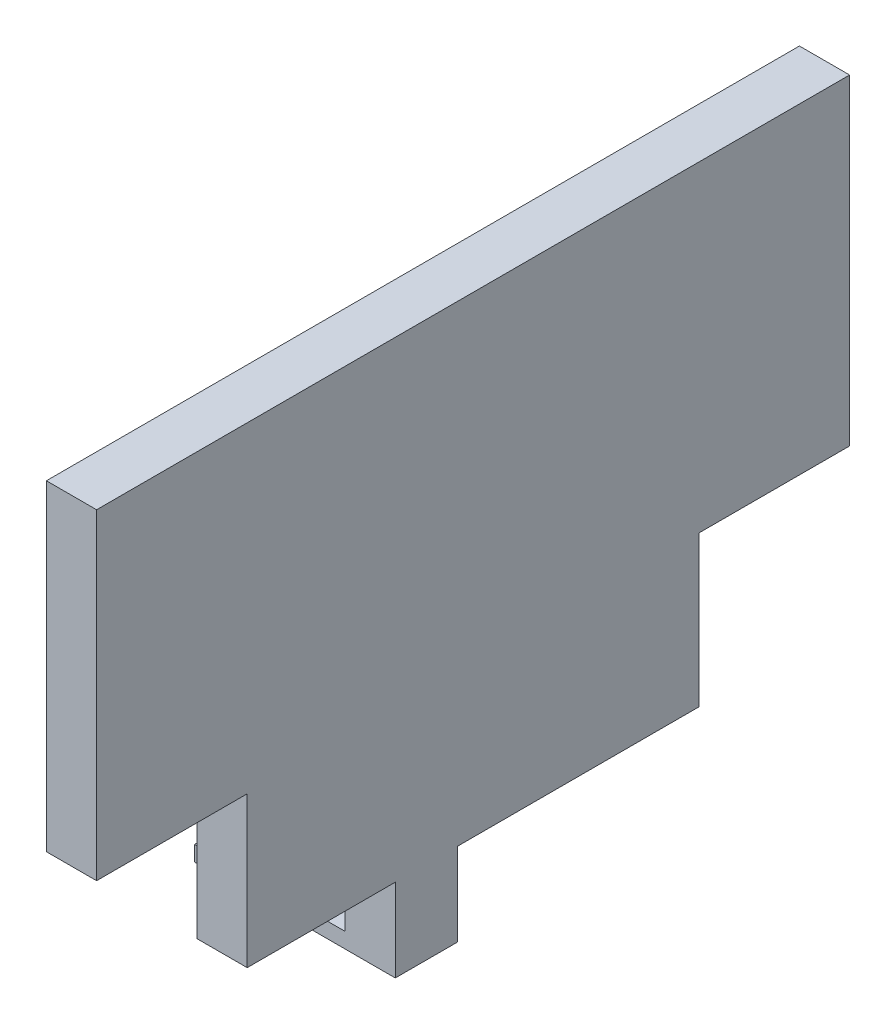
ISO-10303-21;
HEADER;
FILE_DESCRIPTION(('STEP AP214'),'2;1');
FILE_NAME('part.step','',(''),(''),'','','');
FILE_SCHEMA(('AUTOMOTIVE_DESIGN { 1 0 10303 214 1 1 1 1 }'));
ENDSEC;
DATA;
#1=APPLICATION_CONTEXT('core data for automotive mechanical design processes');
#2=APPLICATION_PROTOCOL_DEFINITION('international standard','automotive_design',2000,#1);
#3=PRODUCT_CONTEXT('',#1,'mechanical');
#4=PRODUCT('Part','Part','',(#3));
#5=PRODUCT_RELATED_PRODUCT_CATEGORY('part','',(#4));
#6=PRODUCT_DEFINITION_FORMATION('','',#4);
#7=PRODUCT_DEFINITION_CONTEXT('part definition',#1,'design');
#8=PRODUCT_DEFINITION('design','',#6,#7);
#9=PRODUCT_DEFINITION_SHAPE('','',#8);
#10=(LENGTH_UNIT() NAMED_UNIT(*) SI_UNIT(.MILLI.,.METRE.));
#11=(NAMED_UNIT(*) PLANE_ANGLE_UNIT() SI_UNIT($,.RADIAN.));
#12=(NAMED_UNIT(*) SI_UNIT($,.STERADIAN.) SOLID_ANGLE_UNIT());
#13=UNCERTAINTY_MEASURE_WITH_UNIT(LENGTH_MEASURE(1.E-05),#10,'distance_accuracy_value','');
#14=(GEOMETRIC_REPRESENTATION_CONTEXT(3) GLOBAL_UNCERTAINTY_ASSIGNED_CONTEXT((#13)) GLOBAL_UNIT_ASSIGNED_CONTEXT((#10,
#11,#12)) REPRESENTATION_CONTEXT('',''));
#15=CARTESIAN_POINT('',(0.,0.,0.));
#16=DIRECTION('',(0.,0.,1.));
#17=DIRECTION('',(1.,0.,0.));
#18=AXIS2_PLACEMENT_3D('',#15,#16,#17);
#19=CARTESIAN_POINT('',(-17.5633114324604,119.38,190.5));
#20=DIRECTION('',(1.,0.,0.));
#21=DIRECTION('',(0.,1.,0.));
#22=AXIS2_PLACEMENT_3D('',#19,#20,#21);
#23=PLANE('',#22);
#24=DIRECTION('',(0.,0.,-1.));
#25=VECTOR('',#24,1.);
#26=CARTESIAN_POINT('',(-17.5633114324604,-17.1281883855556,99.2583190448215));
#27=LINE('',#26,#25);
#28=CARTESIAN_POINT('',(-17.5633114324604,-17.1281883855556,114.935884156992));
#29=VERTEX_POINT('',#28);
#30=CARTESIAN_POINT('',(-17.5633114324604,-17.1281883855556,99.2583190448215));
#31=VERTEX_POINT('',#30);
#32=EDGE_CURVE('E51',#29,#31,#27,.T.);
#33=ORIENTED_EDGE('',*,*,#32,.F.);
#34=DIRECTION('',(0.,1.,0.));
#35=VECTOR('',#34,1.);
#36=CARTESIAN_POINT('',(-17.5633114324604,-41.1687256896944,114.935884156992));
#37=LINE('',#36,#35);
#38=CARTESIAN_POINT('',(-17.5633114324604,0.,114.935884156992));
#39=VERTEX_POINT('',#38);
#40=EDGE_CURVE('E177',#29,#39,#37,.T.);
#41=ORIENTED_EDGE('',*,*,#40,.T.);
#42=DIRECTION('',(0.,0.,-1.));
#43=VECTOR('',#42,1.);
#44=CARTESIAN_POINT('',(-17.5633114324604,0.,190.5));
#45=LINE('',#44,#43);
#46=CARTESIAN_POINT('',(-17.5633114324604,0.,152.4));
#47=VERTEX_POINT('',#46);
#48=EDGE_CURVE('E11',#47,#39,#45,.T.);
#49=ORIENTED_EDGE('',*,*,#48,.F.);
#50=DIRECTION('',(0.,-1.,0.));
#51=VECTOR('',#50,1.);
#52=CARTESIAN_POINT('',(-17.5633114324604,38.1,152.4));
#53=LINE('',#52,#51);
#54=CARTESIAN_POINT('',(-17.5633114324604,38.1,152.4));
#55=VERTEX_POINT('',#54);
#56=EDGE_CURVE('E237',#55,#47,#53,.T.);
#57=ORIENTED_EDGE('',*,*,#56,.F.);
#58=DIRECTION('',(0.,0.,-1.));
#59=VECTOR('',#58,1.);
#60=CARTESIAN_POINT('',(-17.5633114324604,38.1,190.5));
#61=LINE('',#60,#59);
#62=CARTESIAN_POINT('',(-17.5633114324604,38.1,190.5));
#63=VERTEX_POINT('',#62);
#64=EDGE_CURVE('E240',#63,#55,#61,.T.);
#65=ORIENTED_EDGE('',*,*,#64,.F.);
#66=DIRECTION('',(0.,-1.,0.));
#67=VECTOR('',#66,1.);
#68=CARTESIAN_POINT('',(-17.5633114324604,119.38,190.5));
#69=LINE('',#68,#67);
#70=CARTESIAN_POINT('',(-17.5633114324604,119.38,190.5));
#71=VERTEX_POINT('',#70);
#72=EDGE_CURVE('E252',#71,#63,#69,.T.);
#73=ORIENTED_EDGE('',*,*,#72,.F.);
#74=DIRECTION('',(0.,0.,-1.));
#75=VECTOR('',#74,1.);
#76=CARTESIAN_POINT('',(-17.5633114324604,119.38,190.5));
#77=LINE('',#76,#75);
#78=CARTESIAN_POINT('',(-17.5633114324604,119.38,0.));
#79=VERTEX_POINT('',#78);
#80=EDGE_CURVE('E259',#71,#79,#77,.T.);
#81=ORIENTED_EDGE('',*,*,#80,.T.);
#82=DIRECTION('',(0.,-1.,0.));
#83=VECTOR('',#82,1.);
#84=CARTESIAN_POINT('',(-17.5633114324604,119.38,0.));
#85=LINE('',#84,#83);
#86=CARTESIAN_POINT('',(-17.5633114324604,38.1,0.));
#87=VERTEX_POINT('',#86);
#88=EDGE_CURVE('E232',#79,#87,#85,.T.);
#89=ORIENTED_EDGE('',*,*,#88,.T.);
#90=DIRECTION('',(0.,0.,-1.));
#91=VECTOR('',#90,1.);
#92=CARTESIAN_POINT('',(-17.5633114324604,38.1,38.1));
#93=LINE('',#92,#91);
#94=CARTESIAN_POINT('',(-17.5633114324604,38.1,38.1));
#95=VERTEX_POINT('',#94);
#96=EDGE_CURVE('E281',#95,#87,#93,.T.);
#97=ORIENTED_EDGE('',*,*,#96,.F.);
#98=DIRECTION('',(0.,1.,0.));
#99=VECTOR('',#98,1.);
#100=CARTESIAN_POINT('',(-17.5633114324604,38.1,38.1));
#101=LINE('',#100,#99);
#102=CARTESIAN_POINT('',(-17.5633114324604,0.,38.1));
#103=VERTEX_POINT('',#102);
#104=EDGE_CURVE('E283',#103,#95,#101,.T.);
#105=ORIENTED_EDGE('',*,*,#104,.F.);
#106=CARTESIAN_POINT('',(-17.5633114324604,0.,99.2583190448215));
#107=VERTEX_POINT('',#106);
#108=EDGE_CURVE('E43',#107,#103,#45,.T.);
#109=ORIENTED_EDGE('',*,*,#108,.F.);
#110=DIRECTION('',(0.,1.,0.));
#111=VECTOR('',#110,1.);
#112=CARTESIAN_POINT('',(-17.5633114324604,-41.1687256896944,99.2583190448215));
#113=LINE('',#112,#111);
#114=EDGE_CURVE('E186',#31,#107,#113,.T.);
#115=ORIENTED_EDGE('',*,*,#114,.F.);
#116=EDGE_LOOP('',(#33,#41,#49,#57,#65,#73,#81,#89,#97,#105,#109,#115));
#117=FACE_BOUND('',#116,.T.);
#118=ADVANCED_FACE('F35',(#117),#23,.F.);
#119=CARTESIAN_POINT('',(-17.5633114324604,0.,190.5));
#120=DIRECTION('',(0.,1.,0.));
#121=DIRECTION('',(0.,0.,1.));
#122=AXIS2_PLACEMENT_3D('',#119,#120,#121);
#123=PLANE('',#122);
#124=DIRECTION('',(-1.,0.,0.));
#125=VECTOR('',#124,1.);
#126=CARTESIAN_POINT('',(-17.5633114324604,0.,114.935884156992));
#127=LINE('',#126,#125);
#128=CARTESIAN_POINT('',(-4.86331143246037,0.,114.935884156992));
#129=VERTEX_POINT('',#128);
#130=EDGE_CURVE('E58',#129,#39,#127,.T.);
#131=ORIENTED_EDGE('',*,*,#130,.F.);
#132=DIRECTION('',(0.,0.,-1.));
#133=VECTOR('',#132,1.);
#134=CARTESIAN_POINT('',(-4.86331143246037,0.,190.5));
#135=LINE('',#134,#133);
#136=CARTESIAN_POINT('',(-4.86331143246037,0.,152.4));
#137=VERTEX_POINT('',#136);
#138=EDGE_CURVE('E209',#137,#129,#135,.T.);
#139=ORIENTED_EDGE('',*,*,#138,.F.);
#140=DIRECTION('',(-1.,0.,0.));
#141=VECTOR('',#140,1.);
#142=CARTESIAN_POINT('',(-4.86331143246037,0.,152.4));
#143=LINE('',#142,#141);
#144=EDGE_CURVE('E230',#137,#47,#143,.T.);
#145=ORIENTED_EDGE('',*,*,#144,.T.);
#146=ORIENTED_EDGE('',*,*,#48,.T.);
#147=EDGE_LOOP('',(#131,#139,#145,#146));
#148=FACE_BOUND('',#147,.T.);
#149=ADVANCED_FACE('F229',(#148),#123,.F.);
#150=DIRECTION('',(1.,0.,0.));
#151=VECTOR('',#150,1.);
#152=CARTESIAN_POINT('',(-17.5633114324604,0.,99.2583190448215));
#153=LINE('',#152,#151);
#154=CARTESIAN_POINT('',(-4.86331143246037,0.,99.2583190448215));
#155=VERTEX_POINT('',#154);
#156=EDGE_CURVE('E188',#107,#155,#153,.T.);
#157=ORIENTED_EDGE('',*,*,#156,.F.);
#158=ORIENTED_EDGE('',*,*,#108,.T.);
#159=DIRECTION('',(-1.,0.,0.));
#160=VECTOR('',#159,1.);
#161=CARTESIAN_POINT('',(-4.86331143246037,0.,38.1));
#162=LINE('',#161,#160);
#163=CARTESIAN_POINT('',(-4.86331143246037,0.,38.1));
#164=VERTEX_POINT('',#163);
#165=EDGE_CURVE('E245',#164,#103,#162,.T.);
#166=ORIENTED_EDGE('',*,*,#165,.F.);
#167=EDGE_CURVE('E205',#155,#164,#135,.T.);
#168=ORIENTED_EDGE('',*,*,#167,.F.);
#169=EDGE_LOOP('',(#157,#158,#166,#168));
#170=FACE_BOUND('',#169,.T.);
#171=ADVANCED_FACE('F323',(#170),#123,.F.);
#172=CARTESIAN_POINT('',(-4.86331143246038,119.38,190.5));
#173=DIRECTION('',(-1.,0.,0.));
#174=DIRECTION('',(0.,-1.,0.));
#175=AXIS2_PLACEMENT_3D('',#172,#173,#174);
#176=PLANE('',#175);
#177=ORIENTED_EDGE('',*,*,#138,.T.);
#178=DIRECTION('',(0.,1.,0.));
#179=VECTOR('',#178,1.);
#180=CARTESIAN_POINT('',(-4.86331143246037,-41.1687256896944,114.935884156992));
#181=LINE('',#180,#179);
#182=CARTESIAN_POINT('',(-4.86331143246037,-20.9926,114.935884156992));
#183=VERTEX_POINT('',#182);
#184=EDGE_CURVE('E199',#183,#129,#181,.T.);
#185=ORIENTED_EDGE('',*,*,#184,.F.);
#186=DIRECTION('',(0.,0.,1.));
#187=VECTOR('',#186,1.);
#188=CARTESIAN_POINT('',(-4.86331143246037,-20.9926,114.935884156992));
#189=LINE('',#188,#187);
#190=CARTESIAN_POINT('',(-4.86331143246037,-20.9926,99.2583190448215));
#191=VERTEX_POINT('',#190);
#192=EDGE_CURVE('E150',#191,#183,#189,.T.);
#193=ORIENTED_EDGE('',*,*,#192,.F.);
#194=DIRECTION('',(0.,1.,0.));
#195=VECTOR('',#194,1.);
#196=CARTESIAN_POINT('',(-4.86331143246037,-41.1687256896944,99.2583190448215));
#197=LINE('',#196,#195);
#198=EDGE_CURVE('E147',#191,#155,#197,.T.);
#199=ORIENTED_EDGE('',*,*,#198,.T.);
#200=ORIENTED_EDGE('',*,*,#167,.T.);
#201=DIRECTION('',(0.,1.,0.));
#202=VECTOR('',#201,1.);
#203=CARTESIAN_POINT('',(-4.86331143246037,38.1,38.1));
#204=LINE('',#203,#202);
#205=CARTESIAN_POINT('',(-4.86331143246037,38.1,38.1));
#206=VERTEX_POINT('',#205);
#207=EDGE_CURVE('E285',#164,#206,#204,.T.);
#208=ORIENTED_EDGE('',*,*,#207,.T.);
#209=DIRECTION('',(0.,0.,-1.));
#210=VECTOR('',#209,1.);
#211=CARTESIAN_POINT('',(-4.86331143246037,38.1,38.1));
#212=LINE('',#211,#210);
#213=CARTESIAN_POINT('',(-4.86331143246037,38.1,0.));
#214=VERTEX_POINT('',#213);
#215=EDGE_CURVE('E288',#206,#214,#212,.T.);
#216=ORIENTED_EDGE('',*,*,#215,.T.);
#217=DIRECTION('',(0.,1.,0.));
#218=VECTOR('',#217,1.);
#219=CARTESIAN_POINT('',(-4.86331143246038,119.38,0.));
#220=LINE('',#219,#218);
#221=CARTESIAN_POINT('',(-4.86331143246038,119.38,0.));
#222=VERTEX_POINT('',#221);
#223=EDGE_CURVE('E262',#214,#222,#220,.T.);
#224=ORIENTED_EDGE('',*,*,#223,.T.);
#225=DIRECTION('',(0.,0.,-1.));
#226=VECTOR('',#225,1.);
#227=CARTESIAN_POINT('',(-4.86331143246038,119.38,190.5));
#228=LINE('',#227,#226);
#229=CARTESIAN_POINT('',(-4.86331143246038,119.38,190.5));
#230=VERTEX_POINT('',#229);
#231=EDGE_CURVE('E210',#230,#222,#228,.T.);
#232=ORIENTED_EDGE('',*,*,#231,.F.);
#233=DIRECTION('',(0.,1.,0.));
#234=VECTOR('',#233,1.);
#235=CARTESIAN_POINT('',(-4.86331143246038,119.38,190.5));
#236=LINE('',#235,#234);
#237=CARTESIAN_POINT('',(-4.86331143246037,38.1,190.5));
#238=VERTEX_POINT('',#237);
#239=EDGE_CURVE('E254',#238,#230,#236,.T.);
#240=ORIENTED_EDGE('',*,*,#239,.F.);
#241=DIRECTION('',(0.,0.,-1.));
#242=VECTOR('',#241,1.);
#243=CARTESIAN_POINT('',(-4.86331143246037,38.1,190.5));
#244=LINE('',#243,#242);
#245=CARTESIAN_POINT('',(-4.86331143246037,38.1,152.4));
#246=VERTEX_POINT('',#245);
#247=EDGE_CURVE('E242',#238,#246,#244,.T.);
#248=ORIENTED_EDGE('',*,*,#247,.T.);
#249=DIRECTION('',(0.,-1.,0.));
#250=VECTOR('',#249,1.);
#251=CARTESIAN_POINT('',(-4.86331143246037,38.1,152.4));
#252=LINE('',#251,#250);
#253=EDGE_CURVE('E227',#246,#137,#252,.T.);
#254=ORIENTED_EDGE('',*,*,#253,.T.);
#255=EDGE_LOOP('',(#177,#185,#193,#199,#200,#208,#216,#224,#232,#240,#248,#254));
#256=FACE_BOUND('',#255,.T.);
#257=ADVANCED_FACE('F224',(#256),#176,.F.);
#258=CARTESIAN_POINT('',(-17.5633114324604,119.38,190.5));
#259=DIRECTION('',(0.,-1.,0.));
#260=DIRECTION('',(0.,0.,-1.));
#261=AXIS2_PLACEMENT_3D('',#258,#259,#260);
#262=PLANE('',#261);
#263=DIRECTION('',(-1.,0.,0.));
#264=VECTOR('',#263,1.);
#265=CARTESIAN_POINT('',(-17.5633114324604,119.38,0.));
#266=LINE('',#265,#264);
#267=EDGE_CURVE('E255',#222,#79,#266,.T.);
#268=ORIENTED_EDGE('',*,*,#267,.T.);
#269=ORIENTED_EDGE('',*,*,#80,.F.);
#270=DIRECTION('',(-1.,0.,0.));
#271=VECTOR('',#270,1.);
#272=CARTESIAN_POINT('',(-17.5633114324604,119.38,190.5));
#273=LINE('',#272,#271);
#274=EDGE_CURVE('E257',#230,#71,#273,.T.);
#275=ORIENTED_EDGE('',*,*,#274,.F.);
#276=ORIENTED_EDGE('',*,*,#231,.T.);
#277=EDGE_LOOP('',(#268,#269,#275,#276));
#278=FACE_BOUND('',#277,.T.);
#279=ADVANCED_FACE('F272',(#278),#262,.F.);
#280=CARTESIAN_POINT('',(0.,0.,190.5));
#281=DIRECTION('',(0.,0.,1.));
#282=DIRECTION('',(1.,0.,0.));
#283=AXIS2_PLACEMENT_3D('',#280,#281,#282);
#284=PLANE('',#283);
#285=DIRECTION('',(-1.,0.,0.));
#286=VECTOR('',#285,1.);
#287=CARTESIAN_POINT('',(-4.86331143246037,38.1,190.5));
#288=LINE('',#287,#286);
#289=EDGE_CURVE('E250',#238,#63,#288,.T.);
#290=ORIENTED_EDGE('',*,*,#289,.F.);
#291=ORIENTED_EDGE('',*,*,#239,.T.);
#292=ORIENTED_EDGE('',*,*,#274,.T.);
#293=ORIENTED_EDGE('',*,*,#72,.T.);
#294=EDGE_LOOP('',(#290,#291,#292,#293));
#295=FACE_BOUND('',#294,.T.);
#296=ADVANCED_FACE('F331',(#295),#284,.T.);
#297=CARTESIAN_POINT('',(0.,0.,0.));
#298=DIRECTION('',(0.,0.,1.));
#299=DIRECTION('',(1.,0.,0.));
#300=AXIS2_PLACEMENT_3D('',#297,#298,#299);
#301=PLANE('',#300);
#302=ORIENTED_EDGE('',*,*,#223,.F.);
#303=DIRECTION('',(-1.,0.,0.));
#304=VECTOR('',#303,1.);
#305=CARTESIAN_POINT('',(-4.86331143246037,38.1,0.));
#306=LINE('',#305,#304);
#307=EDGE_CURVE('E278',#214,#87,#306,.T.);
#308=ORIENTED_EDGE('',*,*,#307,.T.);
#309=ORIENTED_EDGE('',*,*,#88,.F.);
#310=ORIENTED_EDGE('',*,*,#267,.F.);
#311=EDGE_LOOP('',(#302,#308,#309,#310));
#312=FACE_BOUND('',#311,.T.);
#313=ADVANCED_FACE('F276',(#312),#301,.F.);
#314=CARTESIAN_POINT('',(-4.86331143246037,38.1,152.4));
#315=DIRECTION('',(0.,0.,-1.));
#316=DIRECTION('',(-1.,0.,0.));
#317=AXIS2_PLACEMENT_3D('',#314,#315,#316);
#318=PLANE('',#317);
#319=ORIENTED_EDGE('',*,*,#56,.T.);
#320=ORIENTED_EDGE('',*,*,#144,.F.);
#321=ORIENTED_EDGE('',*,*,#253,.F.);
#322=DIRECTION('',(-1.,0.,0.));
#323=VECTOR('',#322,1.);
#324=CARTESIAN_POINT('',(-4.86331143246037,38.1,152.4));
#325=LINE('',#324,#323);
#326=EDGE_CURVE('E233',#246,#55,#325,.T.);
#327=ORIENTED_EDGE('',*,*,#326,.T.);
#328=EDGE_LOOP('',(#319,#320,#321,#327));
#329=FACE_BOUND('',#328,.T.);
#330=ADVANCED_FACE('F334',(#329),#318,.F.);
#331=CARTESIAN_POINT('',(-4.86331143246037,38.1,190.5));
#332=DIRECTION('',(0.,1.,0.));
#333=DIRECTION('',(0.,0.,1.));
#334=AXIS2_PLACEMENT_3D('',#331,#332,#333);
#335=PLANE('',#334);
#336=ORIENTED_EDGE('',*,*,#64,.T.);
#337=ORIENTED_EDGE('',*,*,#326,.F.);
#338=ORIENTED_EDGE('',*,*,#247,.F.);
#339=ORIENTED_EDGE('',*,*,#289,.T.);
#340=EDGE_LOOP('',(#336,#337,#338,#339));
#341=FACE_BOUND('',#340,.T.);
#342=ADVANCED_FACE('F313',(#341),#335,.F.);
#343=CARTESIAN_POINT('',(-4.86331143246037,38.1,38.1));
#344=DIRECTION('',(0.,0.,1.));
#345=DIRECTION('',(0.,-1.,0.));
#346=AXIS2_PLACEMENT_3D('',#343,#344,#345);
#347=PLANE('',#346);
#348=ORIENTED_EDGE('',*,*,#104,.T.);
#349=DIRECTION('',(-1.,0.,0.));
#350=VECTOR('',#349,1.);
#351=CARTESIAN_POINT('',(-4.86331143246037,38.1,38.1));
#352=LINE('',#351,#350);
#353=EDGE_CURVE('E295',#206,#95,#352,.T.);
#354=ORIENTED_EDGE('',*,*,#353,.F.);
#355=ORIENTED_EDGE('',*,*,#207,.F.);
#356=ORIENTED_EDGE('',*,*,#165,.T.);
#357=EDGE_LOOP('',(#348,#354,#355,#356));
#358=FACE_BOUND('',#357,.T.);
#359=ADVANCED_FACE('F304',(#358),#347,.F.);
#360=CARTESIAN_POINT('',(-4.86331143246037,38.1,38.1));
#361=DIRECTION('',(0.,1.,0.));
#362=DIRECTION('',(0.,0.,1.));
#363=AXIS2_PLACEMENT_3D('',#360,#361,#362);
#364=PLANE('',#363);
#365=ORIENTED_EDGE('',*,*,#96,.T.);
#366=ORIENTED_EDGE('',*,*,#307,.F.);
#367=ORIENTED_EDGE('',*,*,#215,.F.);
#368=ORIENTED_EDGE('',*,*,#353,.T.);
#369=EDGE_LOOP('',(#365,#366,#367,#368));
#370=FACE_BOUND('',#369,.T.);
#371=ADVANCED_FACE('F302',(#370),#364,.F.);
#372=CARTESIAN_POINT('',(-17.5633114324604,-41.1687256896944,99.2583190448215));
#373=DIRECTION('',(0.,0.,1.));
#374=DIRECTION('',(1.,0.,0.));
#375=AXIS2_PLACEMENT_3D('',#372,#373,#374);
#376=PLANE('',#375);
#377=DIRECTION('',(1.,0.,0.));
#378=VECTOR('',#377,1.);
#379=CARTESIAN_POINT('',(-17.5633114324604,-20.9926,99.2583190448215));
#380=LINE('',#379,#378);
#381=CARTESIAN_POINT('',(-55.6633114324604,-20.9926,99.2583190448215));
#382=VERTEX_POINT('',#381);
#383=EDGE_CURVE('E139',#382,#191,#380,.T.);
#384=ORIENTED_EDGE('',*,*,#383,.F.);
#385=DIRECTION('',(0.,-1.,0.));
#386=VECTOR('',#385,1.);
#387=CARTESIAN_POINT('',(-55.6633114324604,-17.1281883855556,99.2583190448215));
#388=LINE('',#387,#386);
#389=CARTESIAN_POINT('',(-55.6633114324604,-17.1281883855556,99.2583190448215));
#390=VERTEX_POINT('',#389);
#391=EDGE_CURVE('E144',#390,#382,#388,.T.);
#392=ORIENTED_EDGE('',*,*,#391,.F.);
#393=DIRECTION('',(1.,0.,0.));
#394=VECTOR('',#393,1.);
#395=CARTESIAN_POINT('',(-55.6633114324604,-17.1281883855556,99.2583190448215));
#396=LINE('',#395,#394);
#397=EDGE_CURVE('E170',#390,#31,#396,.T.);
#398=ORIENTED_EDGE('',*,*,#397,.T.);
#399=ORIENTED_EDGE('',*,*,#114,.T.);
#400=ORIENTED_EDGE('',*,*,#156,.T.);
#401=ORIENTED_EDGE('',*,*,#198,.F.);
#402=EDGE_LOOP('',(#384,#392,#398,#399,#400,#401));
#403=FACE_BOUND('',#402,.T.);
#404=ADVANCED_FACE('F141',(#403),#376,.F.);
#405=CARTESIAN_POINT('',(-17.5633114324604,-41.1687256896944,114.935884156992));
#406=DIRECTION('',(0.,0.,-1.));
#407=DIRECTION('',(-1.,0.,0.));
#408=AXIS2_PLACEMENT_3D('',#405,#406,#407);
#409=PLANE('',#408);
#410=DIRECTION('',(-1.,0.,0.));
#411=VECTOR('',#410,1.);
#412=CARTESIAN_POINT('',(-17.5633114324604,-20.9926,114.935884156992));
#413=LINE('',#412,#411);
#414=CARTESIAN_POINT('',(-55.6633114324604,-20.9926,114.935884156992));
#415=VERTEX_POINT('',#414);
#416=EDGE_CURVE('E151',#183,#415,#413,.T.);
#417=ORIENTED_EDGE('',*,*,#416,.F.);
#418=ORIENTED_EDGE('',*,*,#184,.T.);
#419=ORIENTED_EDGE('',*,*,#130,.T.);
#420=ORIENTED_EDGE('',*,*,#40,.F.);
#421=DIRECTION('',(1.,0.,0.));
#422=VECTOR('',#421,1.);
#423=CARTESIAN_POINT('',(-55.6633114324604,-17.1281883855556,114.935884156992));
#424=LINE('',#423,#422);
#425=CARTESIAN_POINT('',(-55.6633114324604,-17.1281883855556,114.935884156992));
#426=VERTEX_POINT('',#425);
#427=EDGE_CURVE('E181',#426,#29,#424,.T.);
#428=ORIENTED_EDGE('',*,*,#427,.F.);
#429=DIRECTION('',(0.,1.,0.));
#430=VECTOR('',#429,1.);
#431=CARTESIAN_POINT('',(-55.6633114324604,-17.1281883855556,114.935884156992));
#432=LINE('',#431,#430);
#433=EDGE_CURVE('E159',#415,#426,#432,.T.);
#434=ORIENTED_EDGE('',*,*,#433,.F.);
#435=EDGE_LOOP('',(#417,#418,#419,#420,#428,#434));
#436=FACE_BOUND('',#435,.T.);
#437=ADVANCED_FACE('F311',(#436),#409,.F.);
#438=CARTESIAN_POINT('',(-49.3133114324634,-20.9926,95.2499999999972));
#439=DIRECTION('',(0.,-1.,0.));
#440=DIRECTION('',(-1.,0.,0.));
#441=AXIS2_PLACEMENT_3D('',#438,#439,#440);
#442=PLANE('',#441);
#443=ORIENTED_EDGE('',*,*,#416,.T.);
#444=DIRECTION('',(0.,0.,1.));
#445=VECTOR('',#444,1.);
#446=CARTESIAN_POINT('',(-55.6633114324604,-20.9926,99.2583190448215));
#447=LINE('',#446,#445);
#448=EDGE_CURVE('E154',#382,#415,#447,.T.);
#449=ORIENTED_EDGE('',*,*,#448,.F.);
#450=ORIENTED_EDGE('',*,*,#383,.T.);
#451=ORIENTED_EDGE('',*,*,#192,.T.);
#452=EDGE_LOOP('',(#443,#449,#450,#451));
#453=FACE_BOUND('',#452,.T.);
#454=ADVANCED_FACE('F155',(#453),#442,.T.);
#455=CARTESIAN_POINT('',(-55.6633114324604,-17.1281883855556,99.2583190448215));
#456=DIRECTION('',(0.,-1.,0.));
#457=DIRECTION('',(1.,0.,0.));
#458=AXIS2_PLACEMENT_3D('',#455,#456,#457);
#459=PLANE('',#458);
#460=ORIENTED_EDGE('',*,*,#32,.T.);
#461=ORIENTED_EDGE('',*,*,#397,.F.);
#462=DIRECTION('',(0.,0.,-1.));
#463=VECTOR('',#462,1.);
#464=CARTESIAN_POINT('',(-55.6633114324604,-17.1281883855556,99.2583190448215));
#465=LINE('',#464,#463);
#466=EDGE_CURVE('E163',#426,#390,#465,.T.);
#467=ORIENTED_EDGE('',*,*,#466,.F.);
#468=ORIENTED_EDGE('',*,*,#427,.T.);
#469=EDGE_LOOP('',(#460,#461,#467,#468));
#470=FACE_BOUND('',#469,.T.);
#471=ADVANCED_FACE('F402',(#470),#459,.F.);
#472=CARTESIAN_POINT('',(-55.6633114324604,0.,0.));
#473=DIRECTION('',(-1.,0.,0.));
#474=DIRECTION('',(0.,0.,1.));
#475=AXIS2_PLACEMENT_3D('',#472,#473,#474);
#476=PLANE('',#475);
#477=ORIENTED_EDGE('',*,*,#391,.T.);
#478=ORIENTED_EDGE('',*,*,#448,.T.);
#479=ORIENTED_EDGE('',*,*,#433,.T.);
#480=ORIENTED_EDGE('',*,*,#466,.T.);
#481=EDGE_LOOP('',(#477,#478,#479,#480));
#482=FACE_BOUND('',#481,.T.);
#483=ADVANCED_FACE('F161',(#482),#476,.T.);
#484=CLOSED_SHELL('',(#118,#149,#171,#257,#279,#296,#313,#330,#342,#359,#371,#404,#437,#454,
#471,#483));
#485=MANIFOLD_SOLID_BREP('B2',#484);
#486=ADVANCED_BREP_SHAPE_REPRESENTATION('',(#18,#485),#14);
#487=SHAPE_DEFINITION_REPRESENTATION(#9,#486);
ENDSEC;
END-ISO-10303-21;
